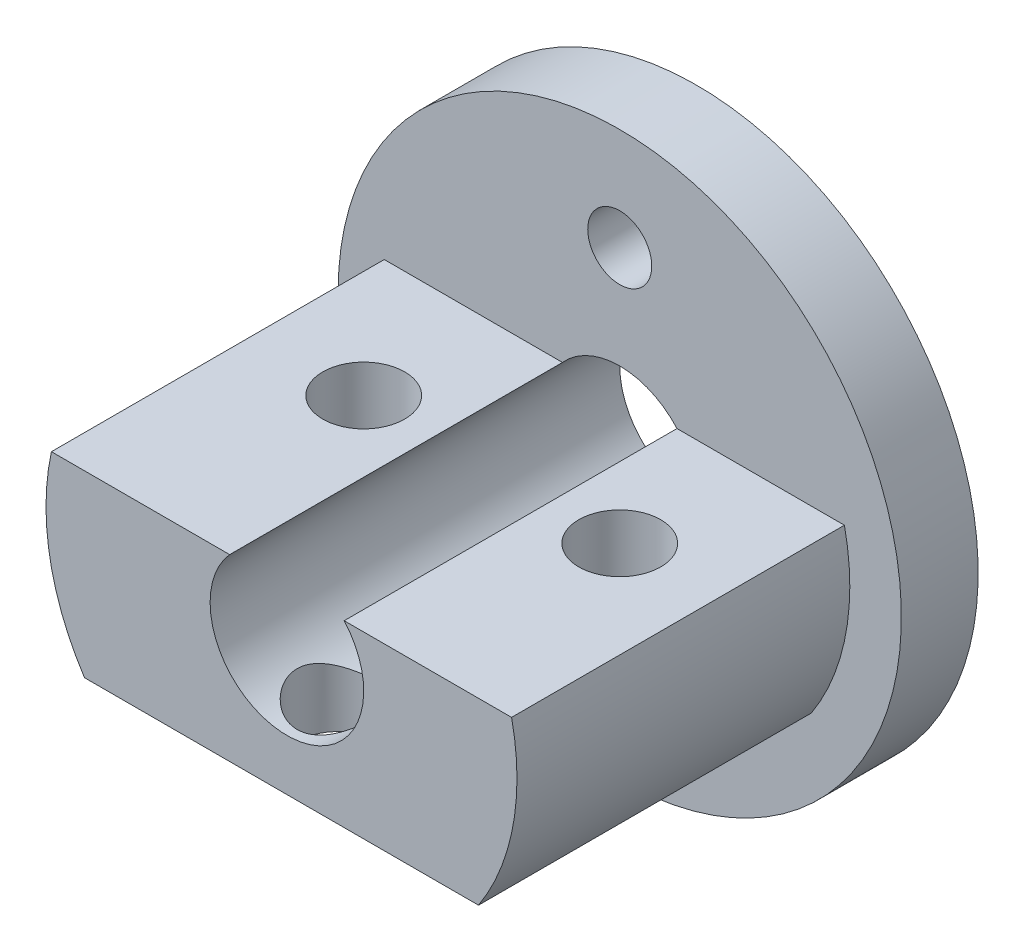
ISO-10303-21;
HEADER;
FILE_DESCRIPTION(('STEP AP214'),'2;1');
FILE_NAME('part.step','',(''),(''),'','','');
FILE_SCHEMA(('AUTOMOTIVE_DESIGN { 1 0 10303 214 1 1 1 1 }'));
ENDSEC;
DATA;
#1=APPLICATION_CONTEXT('core data for automotive mechanical design processes');
#2=APPLICATION_PROTOCOL_DEFINITION('international standard','automotive_design',2000,#1);
#3=PRODUCT_CONTEXT('',#1,'mechanical');
#4=PRODUCT('Part','Part','',(#3));
#5=PRODUCT_RELATED_PRODUCT_CATEGORY('part','',(#4));
#6=PRODUCT_DEFINITION_FORMATION('','',#4);
#7=PRODUCT_DEFINITION_CONTEXT('part definition',#1,'design');
#8=PRODUCT_DEFINITION('design','',#6,#7);
#9=PRODUCT_DEFINITION_SHAPE('','',#8);
#10=(LENGTH_UNIT() NAMED_UNIT(*) SI_UNIT(.MILLI.,.METRE.));
#11=(NAMED_UNIT(*) PLANE_ANGLE_UNIT() SI_UNIT($,.RADIAN.));
#12=(NAMED_UNIT(*) SI_UNIT($,.STERADIAN.) SOLID_ANGLE_UNIT());
#13=UNCERTAINTY_MEASURE_WITH_UNIT(LENGTH_MEASURE(1.E-05),#10,'distance_accuracy_value','');
#14=(GEOMETRIC_REPRESENTATION_CONTEXT(3) GLOBAL_UNCERTAINTY_ASSIGNED_CONTEXT((#13)) GLOBAL_UNIT_ASSIGNED_CONTEXT((#10,
#11,#12)) REPRESENTATION_CONTEXT('',''));
#15=CARTESIAN_POINT('',(0.,0.,0.));
#16=DIRECTION('',(0.,0.,1.));
#17=DIRECTION('',(1.,0.,0.));
#18=AXIS2_PLACEMENT_3D('',#15,#16,#17);
#19=CARTESIAN_POINT('',(-9.19878933080753,2.,16.));
#20=DIRECTION('',(0.,-1.,0.));
#21=DIRECTION('',(0.,0.,-1.));
#22=AXIS2_PLACEMENT_3D('',#19,#20,#21);
#23=PLANE('',#22);
#24=CARTESIAN_POINT('',(-5.,2.,8.));
#25=DIRECTION('',(0.,-1.,0.));
#26=DIRECTION('',(0.,0.,-1.));
#27=AXIS2_PLACEMENT_3D('',#24,#25,#26);
#28=CIRCLE('',#27,1.59999999999999);
#29=CARTESIAN_POINT('',(-5.,2.,6.40000000000001));
#30=VERTEX_POINT('',#29);
#31=EDGE_CURVE('E199',#30,#30,#28,.T.);
#32=ORIENTED_EDGE('',*,*,#31,.T.);
#33=EDGE_LOOP('',(#32));
#34=FACE_BOUND('',#33,.T.);
#35=DIRECTION('',(-1.,0.,0.));
#36=VECTOR('',#35,1.);
#37=CARTESIAN_POINT('',(-9.19878933080753,2.,16.));
#38=LINE('',#37,#36);
#39=CARTESIAN_POINT('',(-2.23606797749977,2.,16.));
#40=VERTEX_POINT('',#39);
#41=CARTESIAN_POINT('',(-9.19878933080753,2.,16.));
#42=VERTEX_POINT('',#41);
#43=EDGE_CURVE('E127',#40,#42,#38,.T.);
#44=ORIENTED_EDGE('',*,*,#43,.F.);
#45=DIRECTION('',(0.,0.,-1.));
#46=VECTOR('',#45,1.);
#47=CARTESIAN_POINT('',(-2.23606797749977,2.,0.));
#48=LINE('',#47,#46);
#49=CARTESIAN_POINT('',(-2.23606797749977,2.,3.));
#50=VERTEX_POINT('',#49);
#51=EDGE_CURVE('E11',#40,#50,#48,.T.);
#52=ORIENTED_EDGE('',*,*,#51,.T.);
#53=DIRECTION('',(-1.,0.,0.));
#54=VECTOR('',#53,1.);
#55=CARTESIAN_POINT('',(-9.19878933080753,2.,3.));
#56=LINE('',#55,#54);
#57=CARTESIAN_POINT('',(-9.19878933080753,2.,3.));
#58=VERTEX_POINT('',#57);
#59=EDGE_CURVE('E141',#50,#58,#56,.T.);
#60=ORIENTED_EDGE('',*,*,#59,.T.);
#61=DIRECTION('',(0.,0.,-1.));
#62=VECTOR('',#61,1.);
#63=CARTESIAN_POINT('',(-9.19878933080753,2.,16.));
#64=LINE('',#63,#62);
#65=EDGE_CURVE('E159',#42,#58,#64,.T.);
#66=ORIENTED_EDGE('',*,*,#65,.F.);
#67=EDGE_LOOP('',(#44,#52,#60,#66));
#68=FACE_BOUND('',#67,.T.);
#69=ADVANCED_FACE('F47',(#34,#68),#23,.F.);
#70=CARTESIAN_POINT('',(0.,0.,3.));
#71=DIRECTION('',(0.,0.,-1.));
#72=DIRECTION('',(-1.,0.,0.));
#73=AXIS2_PLACEMENT_3D('',#70,#71,#72);
#74=CYLINDRICAL_SURFACE('',#73,11.);
#75=CARTESIAN_POINT('',(0.,0.,3.));
#76=DIRECTION('',(0.,0.,-1.));
#77=DIRECTION('',(-1.,0.,0.));
#78=AXIS2_PLACEMENT_3D('',#75,#76,#77);
#79=CIRCLE('',#78,11.);
#80=CARTESIAN_POINT('',(-11.,0.,3.));
#81=VERTEX_POINT('',#80);
#82=EDGE_CURVE('E110',#81,#81,#79,.T.);
#83=ORIENTED_EDGE('',*,*,#82,.T.);
#84=EDGE_LOOP('',(#83));
#85=FACE_BOUND('',#84,.T.);
#86=CARTESIAN_POINT('',(0.,0.,0.));
#87=DIRECTION('',(0.,0.,-1.));
#88=DIRECTION('',(-1.,0.,0.));
#89=AXIS2_PLACEMENT_3D('',#86,#87,#88);
#90=CIRCLE('',#89,11.);
#91=CARTESIAN_POINT('',(-11.,0.,0.));
#92=VERTEX_POINT('',#91);
#93=EDGE_CURVE('E166',#92,#92,#90,.T.);
#94=ORIENTED_EDGE('',*,*,#93,.F.);
#95=EDGE_LOOP('',(#94));
#96=FACE_BOUND('',#95,.T.);
#97=ADVANCED_FACE('F49',(#85,#96),#74,.T.);
#98=CARTESIAN_POINT('',(11.,0.,3.));
#99=DIRECTION('',(0.,0.,1.));
#100=DIRECTION('',(1.,0.,0.));
#101=AXIS2_PLACEMENT_3D('',#98,#99,#100);
#102=PLANE('',#101);
#103=CARTESIAN_POINT('',(0.,0.,3.));
#104=DIRECTION('',(0.,0.,1.));
#105=DIRECTION('',(1.,0.,0.));
#106=AXIS2_PLACEMENT_3D('',#103,#104,#105);
#107=CIRCLE('',#106,2.99999999999999);
#108=CARTESIAN_POINT('',(2.23606797749977,2.,3.));
#109=VERTEX_POINT('',#108);
#110=EDGE_CURVE('E207',#109,#50,#107,.T.);
#111=ORIENTED_EDGE('',*,*,#110,.F.);
#112=CARTESIAN_POINT('',(8.77496438739212,2.,3.));
#113=VERTEX_POINT('',#112);
#114=EDGE_CURVE('E118',#113,#109,#56,.T.);
#115=ORIENTED_EDGE('',*,*,#114,.F.);
#116=CARTESIAN_POINT('',(-0.211912471707704,0.0391023803214335,3.));
#117=DIRECTION('',(0.,0.,1.));
#118=DIRECTION('',(-1.,0.,0.));
#119=AXIS2_PLACEMENT_3D('',#116,#117,#118);
#120=CIRCLE('',#119,9.19831914838167);
#121=CARTESIAN_POINT('',(7.48331477354788,-5.,3.));
#122=VERTEX_POINT('',#121);
#123=EDGE_CURVE('E75',#122,#113,#120,.T.);
#124=ORIENTED_EDGE('',*,*,#123,.F.);
#125=DIRECTION('',(1.,0.,0.));
#126=VECTOR('',#125,1.);
#127=CARTESIAN_POINT('',(7.48331477354788,-5.,3.));
#128=LINE('',#127,#126);
#129=CARTESIAN_POINT('',(-7.90713971696329,-5.,3.));
#130=VERTEX_POINT('',#129);
#131=EDGE_CURVE('E149',#130,#122,#128,.T.);
#132=ORIENTED_EDGE('',*,*,#131,.F.);
#133=CARTESIAN_POINT('',(-0.211912471707704,0.0391023803214335,3.));
#134=DIRECTION('',(0.,0.,1.));
#135=DIRECTION('',(-1.,0.,0.));
#136=AXIS2_PLACEMENT_3D('',#133,#134,#135);
#137=CIRCLE('',#136,9.19831914838168);
#138=EDGE_CURVE('E145',#58,#130,#137,.T.);
#139=ORIENTED_EDGE('',*,*,#138,.F.);
#140=ORIENTED_EDGE('',*,*,#59,.F.);
#141=EDGE_LOOP('',(#111,#115,#124,#132,#139,#140));
#142=FACE_BOUND('',#141,.T.);
#143=CARTESIAN_POINT('',(0.,-7.,3.));
#144=DIRECTION('',(0.,0.,1.));
#145=DIRECTION('',(1.,0.,0.));
#146=AXIS2_PLACEMENT_3D('',#143,#144,#145);
#147=CIRCLE('',#146,1.24999999999999);
#148=CARTESIAN_POINT('',(1.24999999999999,-7.,3.));
#149=VERTEX_POINT('',#148);
#150=EDGE_CURVE('E180',#149,#149,#147,.T.);
#151=ORIENTED_EDGE('',*,*,#150,.F.);
#152=EDGE_LOOP('',(#151));
#153=FACE_BOUND('',#152,.T.);
#154=CARTESIAN_POINT('',(0.,7.,3.));
#155=DIRECTION('',(0.,0.,1.));
#156=DIRECTION('',(1.,0.,0.));
#157=AXIS2_PLACEMENT_3D('',#154,#155,#156);
#158=CIRCLE('',#157,1.24999999999999);
#159=CARTESIAN_POINT('',(1.24999999999999,7.,3.));
#160=VERTEX_POINT('',#159);
#161=EDGE_CURVE('E142',#160,#160,#158,.T.);
#162=ORIENTED_EDGE('',*,*,#161,.F.);
#163=EDGE_LOOP('',(#162));
#164=FACE_BOUND('',#163,.T.);
#165=ORIENTED_EDGE('',*,*,#82,.F.);
#166=EDGE_LOOP('',(#165));
#167=FACE_BOUND('',#166,.T.);
#168=ADVANCED_FACE('F240',(#142,#153,#164,#167),#102,.T.);
#169=CARTESIAN_POINT('',(0.,0.,0.));
#170=DIRECTION('',(0.,0.,-1.));
#171=DIRECTION('',(-1.,0.,0.));
#172=AXIS2_PLACEMENT_3D('',#169,#170,#171);
#173=PLANE('',#172);
#174=CARTESIAN_POINT('',(0.,0.,0.));
#175=DIRECTION('',(0.,0.,-1.));
#176=DIRECTION('',(-1.,0.,0.));
#177=AXIS2_PLACEMENT_3D('',#174,#175,#176);
#178=CIRCLE('',#177,2.99999999999999);
#179=CARTESIAN_POINT('',(-2.99999999999999,0.,0.));
#180=VERTEX_POINT('',#179);
#181=EDGE_CURVE('E209',#180,#180,#178,.T.);
#182=ORIENTED_EDGE('',*,*,#181,.F.);
#183=EDGE_LOOP('',(#182));
#184=FACE_BOUND('',#183,.T.);
#185=CARTESIAN_POINT('',(0.,-7.,0.));
#186=DIRECTION('',(0.,0.,-1.));
#187=DIRECTION('',(-1.,0.,0.));
#188=AXIS2_PLACEMENT_3D('',#185,#186,#187);
#189=CIRCLE('',#188,1.24999999999999);
#190=CARTESIAN_POINT('',(-1.24999999999999,-7.,0.));
#191=VERTEX_POINT('',#190);
#192=EDGE_CURVE('E185',#191,#191,#189,.T.);
#193=ORIENTED_EDGE('',*,*,#192,.F.);
#194=EDGE_LOOP('',(#193));
#195=FACE_BOUND('',#194,.T.);
#196=CARTESIAN_POINT('',(0.,7.,0.));
#197=DIRECTION('',(0.,0.,-1.));
#198=DIRECTION('',(-1.,0.,0.));
#199=AXIS2_PLACEMENT_3D('',#196,#197,#198);
#200=CIRCLE('',#199,1.24999999999999);
#201=CARTESIAN_POINT('',(-1.24999999999999,7.,0.));
#202=VERTEX_POINT('',#201);
#203=EDGE_CURVE('E175',#202,#202,#200,.T.);
#204=ORIENTED_EDGE('',*,*,#203,.F.);
#205=EDGE_LOOP('',(#204));
#206=FACE_BOUND('',#205,.T.);
#207=ORIENTED_EDGE('',*,*,#93,.T.);
#208=EDGE_LOOP('',(#207));
#209=FACE_BOUND('',#208,.T.);
#210=ADVANCED_FACE('F257',(#184,#195,#206,#209),#173,.T.);
#211=CARTESIAN_POINT('',(-0.211912471707704,0.0391023803214335,16.));
#212=DIRECTION('',(0.,0.,-1.));
#213=DIRECTION('',(-1.,0.,0.));
#214=AXIS2_PLACEMENT_3D('',#211,#212,#213);
#215=CYLINDRICAL_SURFACE('',#214,9.19831914838167);
#216=ORIENTED_EDGE('',*,*,#123,.T.);
#217=DIRECTION('',(0.,0.,-1.));
#218=VECTOR('',#217,1.);
#219=CARTESIAN_POINT('',(8.77496438739212,2.,16.));
#220=LINE('',#219,#218);
#221=CARTESIAN_POINT('',(8.77496438739212,2.,16.));
#222=VERTEX_POINT('',#221);
#223=EDGE_CURVE('E163',#222,#113,#220,.T.);
#224=ORIENTED_EDGE('',*,*,#223,.F.);
#225=CARTESIAN_POINT('',(-0.211912471707704,0.0391023803214335,16.));
#226=DIRECTION('',(0.,0.,1.));
#227=DIRECTION('',(-1.,0.,0.));
#228=AXIS2_PLACEMENT_3D('',#225,#226,#227);
#229=CIRCLE('',#228,9.19831914838167);
#230=CARTESIAN_POINT('',(7.48331477354788,-5.,16.));
#231=VERTEX_POINT('',#230);
#232=EDGE_CURVE('E123',#231,#222,#229,.T.);
#233=ORIENTED_EDGE('',*,*,#232,.F.);
#234=DIRECTION('',(0.,0.,-1.));
#235=VECTOR('',#234,1.);
#236=CARTESIAN_POINT('',(7.48331477354788,-5.,16.));
#237=LINE('',#236,#235);
#238=EDGE_CURVE('E138',#231,#122,#237,.T.);
#239=ORIENTED_EDGE('',*,*,#238,.T.);
#240=EDGE_LOOP('',(#216,#224,#233,#239));
#241=FACE_BOUND('',#240,.T.);
#242=ADVANCED_FACE('F247',(#241),#215,.T.);
#243=CARTESIAN_POINT('',(5.,2.,8.));
#244=DIRECTION('',(0.,-1.,0.));
#245=DIRECTION('',(0.,0.,-1.));
#246=AXIS2_PLACEMENT_3D('',#243,#244,#245);
#247=CIRCLE('',#246,1.59999999999999);
#248=CARTESIAN_POINT('',(5.,2.,6.40000000000001));
#249=VERTEX_POINT('',#248);
#250=EDGE_CURVE('E191',#249,#249,#247,.T.);
#251=ORIENTED_EDGE('',*,*,#250,.T.);
#252=EDGE_LOOP('',(#251));
#253=FACE_BOUND('',#252,.T.);
#254=ORIENTED_EDGE('',*,*,#114,.T.);
#255=DIRECTION('',(0.,0.,-1.));
#256=VECTOR('',#255,1.);
#257=CARTESIAN_POINT('',(2.23606797749977,2.,0.));
#258=LINE('',#257,#256);
#259=CARTESIAN_POINT('',(2.23606797749977,2.,16.));
#260=VERTEX_POINT('',#259);
#261=EDGE_CURVE('E62',#109,#260,#258,.F.);
#262=ORIENTED_EDGE('',*,*,#261,.T.);
#263=EDGE_CURVE('E116',#222,#260,#38,.T.);
#264=ORIENTED_EDGE('',*,*,#263,.F.);
#265=ORIENTED_EDGE('',*,*,#223,.T.);
#266=EDGE_LOOP('',(#254,#262,#264,#265));
#267=FACE_BOUND('',#266,.T.);
#268=ADVANCED_FACE('F114',(#253,#267),#23,.F.);
#269=CARTESIAN_POINT('',(-0.211912471707704,0.0391023803214335,16.));
#270=DIRECTION('',(0.,0.,-1.));
#271=DIRECTION('',(-1.,0.,0.));
#272=AXIS2_PLACEMENT_3D('',#269,#270,#271);
#273=CYLINDRICAL_SURFACE('',#272,9.19831914838168);
#274=ORIENTED_EDGE('',*,*,#138,.T.);
#275=DIRECTION('',(0.,0.,-1.));
#276=VECTOR('',#275,1.);
#277=CARTESIAN_POINT('',(-7.90713971696329,-5.,16.));
#278=LINE('',#277,#276);
#279=CARTESIAN_POINT('',(-7.90713971696329,-5.,16.));
#280=VERTEX_POINT('',#279);
#281=EDGE_CURVE('E155',#280,#130,#278,.T.);
#282=ORIENTED_EDGE('',*,*,#281,.F.);
#283=CARTESIAN_POINT('',(-0.211912471707704,0.0391023803214335,16.));
#284=DIRECTION('',(0.,0.,1.));
#285=DIRECTION('',(-1.,0.,0.));
#286=AXIS2_PLACEMENT_3D('',#283,#284,#285);
#287=CIRCLE('',#286,9.19831914838168);
#288=EDGE_CURVE('E126',#42,#280,#287,.T.);
#289=ORIENTED_EDGE('',*,*,#288,.F.);
#290=ORIENTED_EDGE('',*,*,#65,.T.);
#291=EDGE_LOOP('',(#274,#282,#289,#290));
#292=FACE_BOUND('',#291,.T.);
#293=ADVANCED_FACE('F246',(#292),#273,.T.);
#294=CARTESIAN_POINT('',(7.48331477354788,-5.,16.));
#295=DIRECTION('',(0.,1.,0.));
#296=DIRECTION('',(0.,0.,1.));
#297=AXIS2_PLACEMENT_3D('',#294,#295,#296);
#298=PLANE('',#297);
#299=CARTESIAN_POINT('',(0.,-5.,14.));
#300=DIRECTION('',(0.,-1.,0.));
#301=DIRECTION('',(0.,0.,-1.));
#302=AXIS2_PLACEMENT_3D('',#299,#300,#301);
#303=CIRCLE('',#302,1.59999999999999);
#304=CARTESIAN_POINT('',(0.,-5.,12.4));
#305=VERTEX_POINT('',#304);
#306=EDGE_CURVE('E214',#305,#305,#303,.T.);
#307=ORIENTED_EDGE('',*,*,#306,.F.);
#308=EDGE_LOOP('',(#307));
#309=FACE_BOUND('',#308,.T.);
#310=CARTESIAN_POINT('',(-5.,-5.,8.));
#311=DIRECTION('',(0.,-1.,0.));
#312=DIRECTION('',(0.,0.,-1.));
#313=AXIS2_PLACEMENT_3D('',#310,#311,#312);
#314=CIRCLE('',#313,1.59999999999999);
#315=CARTESIAN_POINT('',(-5.,-5.,6.40000000000001));
#316=VERTEX_POINT('',#315);
#317=EDGE_CURVE('E203',#316,#316,#314,.T.);
#318=ORIENTED_EDGE('',*,*,#317,.F.);
#319=EDGE_LOOP('',(#318));
#320=FACE_BOUND('',#319,.T.);
#321=CARTESIAN_POINT('',(5.,-5.,8.));
#322=DIRECTION('',(0.,-1.,0.));
#323=DIRECTION('',(0.,0.,-1.));
#324=AXIS2_PLACEMENT_3D('',#321,#322,#323);
#325=CIRCLE('',#324,1.59999999999999);
#326=CARTESIAN_POINT('',(5.,-5.,6.40000000000001));
#327=VERTEX_POINT('',#326);
#328=EDGE_CURVE('E195',#327,#327,#325,.T.);
#329=ORIENTED_EDGE('',*,*,#328,.F.);
#330=EDGE_LOOP('',(#329));
#331=FACE_BOUND('',#330,.T.);
#332=ORIENTED_EDGE('',*,*,#131,.T.);
#333=ORIENTED_EDGE('',*,*,#238,.F.);
#334=DIRECTION('',(1.,0.,0.));
#335=VECTOR('',#334,1.);
#336=CARTESIAN_POINT('',(7.48331477354788,-5.,16.));
#337=LINE('',#336,#335);
#338=EDGE_CURVE('E131',#280,#231,#337,.T.);
#339=ORIENTED_EDGE('',*,*,#338,.F.);
#340=ORIENTED_EDGE('',*,*,#281,.T.);
#341=EDGE_LOOP('',(#332,#333,#339,#340));
#342=FACE_BOUND('',#341,.T.);
#343=ADVANCED_FACE('F254',(#309,#320,#331,#342),#298,.F.);
#344=CARTESIAN_POINT('',(-0.211912471707704,0.0391023803214335,16.));
#345=DIRECTION('',(0.,0.,-1.));
#346=DIRECTION('',(-1.,0.,0.));
#347=AXIS2_PLACEMENT_3D('',#344,#345,#346);
#348=PLANE('',#347);
#349=ORIENTED_EDGE('',*,*,#263,.T.);
#350=CARTESIAN_POINT('',(0.,0.,16.));
#351=DIRECTION('',(0.,0.,-1.));
#352=DIRECTION('',(-1.,0.,0.));
#353=AXIS2_PLACEMENT_3D('',#350,#351,#352);
#354=CIRCLE('',#353,2.99999999999999);
#355=EDGE_CURVE('E102',#260,#40,#354,.T.);
#356=ORIENTED_EDGE('',*,*,#355,.T.);
#357=ORIENTED_EDGE('',*,*,#43,.T.);
#358=ORIENTED_EDGE('',*,*,#288,.T.);
#359=ORIENTED_EDGE('',*,*,#338,.T.);
#360=ORIENTED_EDGE('',*,*,#232,.T.);
#361=EDGE_LOOP('',(#349,#356,#357,#358,#359,#360));
#362=FACE_BOUND('',#361,.T.);
#363=ADVANCED_FACE('F121',(#362),#348,.F.);
#364=CARTESIAN_POINT('',(0.,7.,0.));
#365=DIRECTION('',(0.,0.,-1.));
#366=DIRECTION('',(-1.,0.,0.));
#367=AXIS2_PLACEMENT_3D('',#364,#365,#366);
#368=CYLINDRICAL_SURFACE('',#367,1.24999999999999);
#369=ORIENTED_EDGE('',*,*,#161,.T.);
#370=EDGE_LOOP('',(#369));
#371=FACE_BOUND('',#370,.T.);
#372=ORIENTED_EDGE('',*,*,#203,.T.);
#373=EDGE_LOOP('',(#372));
#374=FACE_BOUND('',#373,.T.);
#375=ADVANCED_FACE('F271',(#371,#374),#368,.F.);
#376=CARTESIAN_POINT('',(0.,-7.,0.));
#377=DIRECTION('',(0.,0.,-1.));
#378=DIRECTION('',(-1.,0.,0.));
#379=AXIS2_PLACEMENT_3D('',#376,#377,#378);
#380=CYLINDRICAL_SURFACE('',#379,1.24999999999999);
#381=ORIENTED_EDGE('',*,*,#150,.T.);
#382=EDGE_LOOP('',(#381));
#383=FACE_BOUND('',#382,.T.);
#384=ORIENTED_EDGE('',*,*,#192,.T.);
#385=EDGE_LOOP('',(#384));
#386=FACE_BOUND('',#385,.T.);
#387=ADVANCED_FACE('F263',(#383,#386),#380,.F.);
#388=CARTESIAN_POINT('',(5.,-5.,8.));
#389=DIRECTION('',(0.,-1.,0.));
#390=DIRECTION('',(0.,0.,-1.));
#391=AXIS2_PLACEMENT_3D('',#388,#389,#390);
#392=CYLINDRICAL_SURFACE('',#391,1.59999999999999);
#393=ORIENTED_EDGE('',*,*,#328,.T.);
#394=EDGE_LOOP('',(#393));
#395=FACE_BOUND('',#394,.T.);
#396=ORIENTED_EDGE('',*,*,#250,.F.);
#397=EDGE_LOOP('',(#396));
#398=FACE_BOUND('',#397,.T.);
#399=ADVANCED_FACE('F261',(#395,#398),#392,.F.);
#400=CARTESIAN_POINT('',(-5.,-5.,8.));
#401=DIRECTION('',(0.,-1.,0.));
#402=DIRECTION('',(0.,0.,-1.));
#403=AXIS2_PLACEMENT_3D('',#400,#401,#402);
#404=CYLINDRICAL_SURFACE('',#403,1.59999999999999);
#405=ORIENTED_EDGE('',*,*,#317,.T.);
#406=EDGE_LOOP('',(#405));
#407=FACE_BOUND('',#406,.T.);
#408=ORIENTED_EDGE('',*,*,#31,.F.);
#409=EDGE_LOOP('',(#408));
#410=FACE_BOUND('',#409,.T.);
#411=ADVANCED_FACE('F230',(#407,#410),#404,.F.);
#412=CARTESIAN_POINT('',(0.,0.,0.));
#413=DIRECTION('',(0.,0.,-1.));
#414=DIRECTION('',(-1.,0.,0.));
#415=AXIS2_PLACEMENT_3D('',#412,#413,#414);
#416=CYLINDRICAL_SURFACE('',#415,2.99999999999999);
#417=CARTESIAN_POINT('',(0.,-2.99999999999999,12.4));
#418=CARTESIAN_POINT('',(0.0834280085828009,-2.99999516830783,12.4000054165742));
#419=CARTESIAN_POINT('',(0.166934582506532,-2.99648378720921,12.4065631928234));
#420=CARTESIAN_POINT('',(0.331436394670314,-2.98278259335467,12.4324834017336));
#421=CARTESIAN_POINT('',(0.41242753968287,-2.97258243738722,12.4518656660077));
#422=CARTESIAN_POINT('',(0.569277189891041,-2.94656073601312,12.502439679716));
#423=CARTESIAN_POINT('',(0.645155024474131,-2.93076195982553,12.5335836283788));
#424=CARTESIAN_POINT('',(0.790470948459424,-2.89495499745186,12.606525103425));
#425=CARTESIAN_POINT('',(0.859909008635975,-2.87494679216345,12.6483226781546));
#426=CARTESIAN_POINT('',(0.995534638915586,-2.8309580133015,12.74450312346));
#427=CARTESIAN_POINT('',(1.06120405491229,-2.80680229614066,12.7995352070259));
#428=CARTESIAN_POINT('',(1.18286806133738,-2.75774084341934,12.9192062913871));
#429=CARTESIAN_POINT('',(1.2388541798454,-2.73283447325623,12.9838536135181));
#430=CARTESIAN_POINT('',(1.3447088389684,-2.68244281334123,13.1279561169051));
#431=CARTESIAN_POINT('',(1.39355367383635,-2.65711191284794,13.2082240971211));
#432=CARTESIAN_POINT('',(1.47685283241529,-2.61173677221119,13.3772913624929));
#433=CARTESIAN_POINT('',(1.51131827632935,-2.59168845125878,13.4660839895543));
#434=CARTESIAN_POINT('',(1.56248710339326,-2.56114789725882,13.6441085387691));
#435=CARTESIAN_POINT('',(1.58016623486329,-2.55013659138238,13.7329659441932));
#436=CARTESIAN_POINT('',(1.60018994479718,-2.53762662306211,13.9130077439191));
#437=CARTESIAN_POINT('',(1.60255389391568,-2.53611594428853,14.0041890522654));
#438=CARTESIAN_POINT('',(1.59259204330142,-2.54237297611912,14.1724437312959));
#439=CARTESIAN_POINT('',(1.58228644595418,-2.54886502713221,14.2496968932452));
#440=CARTESIAN_POINT('',(1.55082691014656,-2.56812634563422,14.4011492478833));
#441=CARTESIAN_POINT('',(1.52966860751485,-2.58089813829438,14.4753471990113));
#442=CARTESIAN_POINT('',(1.47678050478153,-2.61152555714279,14.6206760531473));
#443=CARTESIAN_POINT('',(1.44482388986179,-2.62948894800926,14.6917006061701));
#444=CARTESIAN_POINT('',(1.3714330459339,-2.66850094165746,14.8277390527147));
#445=CARTESIAN_POINT('',(1.32999461708735,-2.6895509101076,14.892750264738));
#446=CARTESIAN_POINT('',(1.23173704487369,-2.73609049880501,15.0249717224266));
#447=CARTESIAN_POINT('',(1.17355258231977,-2.76177798986484,15.0911014704934));
#448=CARTESIAN_POINT('',(1.04690274674869,-2.81223117246243,15.2131507153799));
#449=CARTESIAN_POINT('',(0.978431146098911,-2.83699629420454,15.2690639815862));
#450=CARTESIAN_POINT('',(0.828044154062351,-2.88460021999067,15.3722754298284));
#451=CARTESIAN_POINT('',(0.745570968821572,-2.90723646176343,15.4188622163878));
#452=CARTESIAN_POINT('',(0.572453719472279,-2.94620790608509,15.4970957663538));
#453=CARTESIAN_POINT('',(0.481817034499106,-2.96254873003401,15.5287558640062));
#454=CARTESIAN_POINT('',(0.303664427911802,-2.98581991228459,15.5733552248145));
#455=CARTESIAN_POINT('',(0.216600262764055,-2.99346409984952,15.58772140262));
#456=CARTESIAN_POINT('',(0.0409791950824017,-3.00100442054402,15.6018950064009));
#457=CARTESIAN_POINT('',(-0.0475768145688052,-3.0009050343218,15.6017108516046));
#458=CARTESIAN_POINT('',(-0.215091919521218,-2.99334764517663,15.5875001423386));
#459=CARTESIAN_POINT('',(-0.294192898535466,-2.98655794488572,15.5747307185035));
#460=CARTESIAN_POINT('',(-0.448939109663165,-2.96724376655691,15.5377851158042));
#461=CARTESIAN_POINT('',(-0.524583981374493,-2.95471869192972,15.5136077502866));
#462=CARTESIAN_POINT('',(-0.672500335044403,-2.92465141623377,15.4540501150635));
#463=CARTESIAN_POINT('',(-0.744640666753736,-2.90699189924779,15.4184055301634));
#464=CARTESIAN_POINT('',(-0.88212431482192,-2.86826876163521,15.3372496913968));
#465=CARTESIAN_POINT('',(-0.947464964005446,-2.84720381343928,15.2917345872462));
#466=CARTESIAN_POINT('',(-1.07697928921282,-2.80095291390705,15.1865103977845));
#467=CARTESIAN_POINT('',(-1.1402697302165,-2.77556745933857,15.1258006653423));
#468=CARTESIAN_POINT('',(-1.256219725483,-2.72505417098625,14.9947743281697));
#469=CARTESIAN_POINT('',(-1.30886943094941,-2.69992659611923,14.9244489234159));
#470=CARTESIAN_POINT('',(-1.40548153261781,-2.6509902865593,14.7703470276499));
#471=CARTESIAN_POINT('',(-1.44862048937834,-2.62738421458253,14.6859837224412));
#472=CARTESIAN_POINT('',(-1.51964969635314,-2.58695870125935,14.5095798198276));
#473=CARTESIAN_POINT('',(-1.54756166073895,-2.57012960475315,14.4175503717565));
#474=CARTESIAN_POINT('',(-1.58459090361389,-2.54745026922035,14.2379723058049));
#475=CARTESIAN_POINT('',(-1.59528122309046,-2.54068617365326,14.1508676325691));
#476=CARTESIAN_POINT('',(-1.60220766902336,-2.53632719775286,13.9758793716393));
#477=CARTESIAN_POINT('',(-1.5984536494801,-2.53872606639136,13.8879963557548));
#478=CARTESIAN_POINT('',(-1.57811270148831,-2.55140495355655,13.7253072902839));
#479=CARTESIAN_POINT('',(-1.56314118274068,-2.5606915110498,13.6502102185451));
#480=CARTESIAN_POINT('',(-1.52298687295875,-2.5847738344218,13.5037320849178));
#481=CARTESIAN_POINT('',(-1.49780029499238,-2.59957164326812,13.4323524122312));
#482=CARTESIAN_POINT('',(-1.43616070422436,-2.63415331148714,13.2901904409073));
#483=CARTESIAN_POINT('',(-1.39908641485749,-2.65419696823124,13.2197428651699));
#484=CARTESIAN_POINT('',(-1.31534245335432,-2.69667921413439,13.0855961284791));
#485=CARTESIAN_POINT('',(-1.26866761463332,-2.71911908969112,13.0219006292759));
#486=CARTESIAN_POINT('',(-1.15916720525937,-2.76774539611285,12.8934538122456));
#487=CARTESIAN_POINT('',(-1.09498203667426,-2.79400424140763,12.829882519127));
#488=CARTESIAN_POINT('',(-0.956300329149735,-2.84445660127589,12.7140554591992));
#489=CARTESIAN_POINT('',(-0.881797165766545,-2.86864877272257,12.6618070176999));
#490=CARTESIAN_POINT('',(-0.722044005153531,-2.91302030182075,12.5691320802358));
#491=CARTESIAN_POINT('',(-0.63657733112363,-2.93308821046927,12.5290227475325));
#492=CARTESIAN_POINT('',(-0.458798662878489,-2.96607713011318,12.46429275489));
#493=CARTESIAN_POINT('',(-0.366505693768784,-2.97901721406283,12.4396307358165));
#494=CARTESIAN_POINT('',(-0.227615355842187,-2.99169552229493,12.4156146574241));
#495=CARTESIAN_POINT('',(-0.182355494246513,-2.99479888634849,12.4097702315881));
#496=CARTESIAN_POINT('',(-0.0914049548856017,-2.99895246122779,12.4019613956916));
#497=CARTESIAN_POINT('',(-0.045714271978932,-3.0000026475196,12.399997031995));
#498=CARTESIAN_POINT('',(0.,-2.99999999999999,12.4));
#499=B_SPLINE_CURVE_WITH_KNOTS('',3,(#417,#418,#419,#420,#421,#422,#423,#424,#425,#426,#427,
#428,#429,#430,#431,#432,#433,#434,#435,#436,#437,#438,#439,#440,#441,#442,#443,#444,#445,#446,
#447,#448,#449,#450,#451,#452,#453,#454,#455,#456,#457,#458,#459,#460,#461,#462,#463,#464,#465,
#466,#467,#468,#469,#470,#471,#472,#473,#474,#475,#476,#477,#478,#479,#480,#481,#482,#483,#484,
#485,#486,#487,#488,#489,#490,#491,#492,#493,#494,#495,#496,#497,#498),.UNSPECIFIED.,.T.,.F.,(4,
2,2,2,2,2,2,2,2,2,2,2,2,2,2,2,2,2,2,2,2,2,2,2,2,2,2,2,2,2,2,2,2,2,2,2,2,2,2,2,4),(0.,
0.250099571937982,0.500586801159411,0.750066790862752,0.999547912726733,1.26551787503544,
1.53171937023861,1.82220042181314,2.1124564135936,2.38456600858368,2.65633137184322,
2.88985639109231,3.12347539088299,3.36234274397107,3.60131610556612,3.87540340557934,
4.14965730631692,4.4402445969854,4.73057180728937,4.99480330643339,5.25888191498326,
5.49900649956848,5.7391560674071,5.98529384057666,6.23152780022615,6.50427545175257,
6.77727440700566,7.06865169074463,7.35961236784534,7.62207574902759,7.88436010813384,
8.11476177641513,8.34524893751082,8.59058452776178,8.83605249367789,9.11702751803737,
9.39818377987283,9.68615329689649,9.97334846176481,10.1103885689539,10.2474303136581),.UNSPECIFIED.);
#500=CARTESIAN_POINT('',(0.,-2.99999999999999,12.4));
#501=VERTEX_POINT('',#500);
#502=EDGE_CURVE('E51',#501,#501,#499,.T.);
#503=ORIENTED_EDGE('',*,*,#502,.T.);
#504=EDGE_LOOP('',(#503));
#505=FACE_BOUND('',#504,.T.);
#506=ORIENTED_EDGE('',*,*,#181,.T.);
#507=EDGE_LOOP('',(#506));
#508=FACE_BOUND('',#507,.T.);
#509=ORIENTED_EDGE('',*,*,#355,.F.);
#510=ORIENTED_EDGE('',*,*,#261,.F.);
#511=ORIENTED_EDGE('',*,*,#110,.T.);
#512=ORIENTED_EDGE('',*,*,#51,.F.);
#513=EDGE_LOOP('',(#509,#510,#511,#512));
#514=FACE_BOUND('',#513,.T.);
#515=ADVANCED_FACE('F104',(#505,#508,#514),#416,.F.);
#516=CARTESIAN_POINT('',(0.,-5.,14.));
#517=DIRECTION('',(0.,-1.,0.));
#518=DIRECTION('',(0.,0.,-1.));
#519=AXIS2_PLACEMENT_3D('',#516,#517,#518);
#520=CYLINDRICAL_SURFACE('',#519,1.59999999999999);
#521=ORIENTED_EDGE('',*,*,#306,.T.);
#522=EDGE_LOOP('',(#521));
#523=FACE_BOUND('',#522,.T.);
#524=ORIENTED_EDGE('',*,*,#502,.F.);
#525=EDGE_LOOP('',(#524));
#526=FACE_BOUND('',#525,.T.);
#527=ADVANCED_FACE('F225',(#523,#526),#520,.F.);
#528=CLOSED_SHELL('',(#69,#97,#168,#210,#242,#268,#293,#343,#363,#375,#387,#399,#411,#515,#527));
#529=MANIFOLD_SOLID_BREP('B2',#528);
#530=ADVANCED_BREP_SHAPE_REPRESENTATION('',(#18,#529),#14);
#531=SHAPE_DEFINITION_REPRESENTATION(#9,#530);
ENDSEC;
END-ISO-10303-21;
